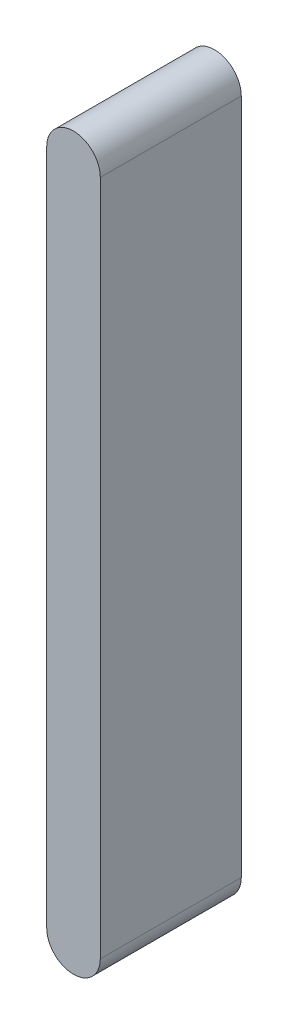
ISO-10303-21;
HEADER;
FILE_DESCRIPTION(('STEP AP214'),'2;1');
FILE_NAME('part.step','',(''),(''),'','','');
FILE_SCHEMA(('AUTOMOTIVE_DESIGN { 1 0 10303 214 1 1 1 1 }'));
ENDSEC;
DATA;
#1=APPLICATION_CONTEXT('core data for automotive mechanical design processes');
#2=APPLICATION_PROTOCOL_DEFINITION('international standard','automotive_design',2000,#1);
#3=PRODUCT_CONTEXT('',#1,'mechanical');
#4=PRODUCT('Part','Part','',(#3));
#5=PRODUCT_RELATED_PRODUCT_CATEGORY('part','',(#4));
#6=PRODUCT_DEFINITION_FORMATION('','',#4);
#7=PRODUCT_DEFINITION_CONTEXT('part definition',#1,'design');
#8=PRODUCT_DEFINITION('design','',#6,#7);
#9=PRODUCT_DEFINITION_SHAPE('','',#8);
#10=(LENGTH_UNIT() NAMED_UNIT(*) SI_UNIT(.MILLI.,.METRE.));
#11=(NAMED_UNIT(*) PLANE_ANGLE_UNIT() SI_UNIT($,.RADIAN.));
#12=(NAMED_UNIT(*) SI_UNIT($,.STERADIAN.) SOLID_ANGLE_UNIT());
#13=UNCERTAINTY_MEASURE_WITH_UNIT(LENGTH_MEASURE(1.E-05),#10,'distance_accuracy_value','');
#14=(GEOMETRIC_REPRESENTATION_CONTEXT(3) GLOBAL_UNCERTAINTY_ASSIGNED_CONTEXT((#13)) GLOBAL_UNIT_ASSIGNED_CONTEXT((#10,
#11,#12)) REPRESENTATION_CONTEXT('',''));
#15=CARTESIAN_POINT('',(0.,0.,0.));
#16=DIRECTION('',(0.,0.,1.));
#17=DIRECTION('',(1.,0.,0.));
#18=AXIS2_PLACEMENT_3D('',#15,#16,#17);
#19=CARTESIAN_POINT('',(0.,17.3590909090909,10.));
#20=DIRECTION('',(0.,0.,-1.));
#21=DIRECTION('',(-1.,0.,0.));
#22=AXIS2_PLACEMENT_3D('',#19,#20,#21);
#23=CYLINDRICAL_SURFACE('',#22,1.9);
#24=CARTESIAN_POINT('',(0.,17.3590909090909,0.));
#25=DIRECTION('',(0.,0.,1.));
#26=DIRECTION('',(1.,0.,0.));
#27=AXIS2_PLACEMENT_3D('',#24,#25,#26);
#28=CIRCLE('',#27,1.9);
#29=CARTESIAN_POINT('',(1.9,17.3590909090909,0.));
#30=VERTEX_POINT('',#29);
#31=CARTESIAN_POINT('',(-1.9,17.3590909090909,0.));
#32=VERTEX_POINT('',#31);
#33=EDGE_CURVE('E103',#30,#32,#28,.T.);
#34=ORIENTED_EDGE('',*,*,#33,.T.);
#35=DIRECTION('',(0.,0.,-1.));
#36=VECTOR('',#35,1.);
#37=CARTESIAN_POINT('',(-1.9,17.3590909090909,10.));
#38=LINE('',#37,#36);
#39=CARTESIAN_POINT('',(-1.9,17.3590909090909,10.));
#40=VERTEX_POINT('',#39);
#41=EDGE_CURVE('E11',#40,#32,#38,.T.);
#42=ORIENTED_EDGE('',*,*,#41,.F.);
#43=CARTESIAN_POINT('',(0.,17.3590909090909,10.));
#44=DIRECTION('',(0.,0.,1.));
#45=DIRECTION('',(1.,0.,0.));
#46=AXIS2_PLACEMENT_3D('',#43,#44,#45);
#47=CIRCLE('',#46,1.9);
#48=CARTESIAN_POINT('',(1.9,17.3590909090909,10.));
#49=VERTEX_POINT('',#48);
#50=EDGE_CURVE('E89',#49,#40,#47,.T.);
#51=ORIENTED_EDGE('',*,*,#50,.F.);
#52=DIRECTION('',(0.,0.,-1.));
#53=VECTOR('',#52,1.);
#54=CARTESIAN_POINT('',(1.9,17.3590909090909,10.));
#55=LINE('',#54,#53);
#56=EDGE_CURVE('E56',#49,#30,#55,.T.);
#57=ORIENTED_EDGE('',*,*,#56,.T.);
#58=EDGE_LOOP('',(#34,#42,#51,#57));
#59=FACE_BOUND('',#58,.T.);
#60=ADVANCED_FACE('F40',(#59),#23,.T.);
#61=CARTESIAN_POINT('',(-1.9,17.3590909090909,10.));
#62=DIRECTION('',(1.,0.,0.));
#63=DIRECTION('',(0.,1.,0.));
#64=AXIS2_PLACEMENT_3D('',#61,#62,#63);
#65=PLANE('',#64);
#66=DIRECTION('',(0.,-1.,0.));
#67=VECTOR('',#66,1.);
#68=CARTESIAN_POINT('',(-1.9,17.3590909090909,0.));
#69=LINE('',#68,#67);
#70=CARTESIAN_POINT('',(-1.89999999999999,-30.6409090909091,0.));
#71=VERTEX_POINT('',#70);
#72=EDGE_CURVE('E94',#32,#71,#69,.T.);
#73=ORIENTED_EDGE('',*,*,#72,.T.);
#74=DIRECTION('',(0.,0.,-1.));
#75=VECTOR('',#74,1.);
#76=CARTESIAN_POINT('',(-1.89999999999999,-30.6409090909091,10.));
#77=LINE('',#76,#75);
#78=CARTESIAN_POINT('',(-1.89999999999999,-30.6409090909091,10.));
#79=VERTEX_POINT('',#78);
#80=EDGE_CURVE('E48',#79,#71,#77,.T.);
#81=ORIENTED_EDGE('',*,*,#80,.F.);
#82=DIRECTION('',(0.,-1.,0.));
#83=VECTOR('',#82,1.);
#84=CARTESIAN_POINT('',(-1.9,17.3590909090909,10.));
#85=LINE('',#84,#83);
#86=EDGE_CURVE('E82',#40,#79,#85,.T.);
#87=ORIENTED_EDGE('',*,*,#86,.F.);
#88=ORIENTED_EDGE('',*,*,#41,.T.);
#89=EDGE_LOOP('',(#73,#81,#87,#88));
#90=FACE_BOUND('',#89,.T.);
#91=ADVANCED_FACE('F93',(#90),#65,.F.);
#92=CARTESIAN_POINT('',(0.,-30.6409090909091,10.));
#93=DIRECTION('',(0.,0.,-1.));
#94=DIRECTION('',(-1.,0.,0.));
#95=AXIS2_PLACEMENT_3D('',#92,#93,#94);
#96=CYLINDRICAL_SURFACE('',#95,1.9);
#97=CARTESIAN_POINT('',(0.,-30.6409090909091,0.));
#98=DIRECTION('',(0.,0.,1.));
#99=DIRECTION('',(1.,0.,0.));
#100=AXIS2_PLACEMENT_3D('',#97,#98,#99);
#101=CIRCLE('',#100,1.9);
#102=CARTESIAN_POINT('',(1.90000000000001,-30.6409090909091,0.));
#103=VERTEX_POINT('',#102);
#104=EDGE_CURVE('E106',#71,#103,#101,.T.);
#105=ORIENTED_EDGE('',*,*,#104,.T.);
#106=DIRECTION('',(0.,0.,-1.));
#107=VECTOR('',#106,1.);
#108=CARTESIAN_POINT('',(1.90000000000001,-30.6409090909091,10.));
#109=LINE('',#108,#107);
#110=CARTESIAN_POINT('',(1.90000000000001,-30.6409090909091,10.));
#111=VERTEX_POINT('',#110);
#112=EDGE_CURVE('E71',#111,#103,#109,.T.);
#113=ORIENTED_EDGE('',*,*,#112,.F.);
#114=CARTESIAN_POINT('',(0.,-30.6409090909091,10.));
#115=DIRECTION('',(0.,0.,1.));
#116=DIRECTION('',(1.,0.,0.));
#117=AXIS2_PLACEMENT_3D('',#114,#115,#116);
#118=CIRCLE('',#117,1.9);
#119=EDGE_CURVE('E88',#79,#111,#118,.T.);
#120=ORIENTED_EDGE('',*,*,#119,.F.);
#121=ORIENTED_EDGE('',*,*,#80,.T.);
#122=EDGE_LOOP('',(#105,#113,#120,#121));
#123=FACE_BOUND('',#122,.T.);
#124=ADVANCED_FACE('F97',(#123),#96,.T.);
#125=CARTESIAN_POINT('',(1.9,17.3590909090909,10.));
#126=DIRECTION('',(1.,0.,0.));
#127=DIRECTION('',(0.,1.,0.));
#128=AXIS2_PLACEMENT_3D('',#125,#126,#127);
#129=PLANE('',#128);
#130=DIRECTION('',(0.,-1.,0.));
#131=VECTOR('',#130,1.);
#132=CARTESIAN_POINT('',(1.9,17.3590909090909,0.));
#133=LINE('',#132,#131);
#134=EDGE_CURVE('E108',#30,#103,#133,.T.);
#135=ORIENTED_EDGE('',*,*,#134,.F.);
#136=ORIENTED_EDGE('',*,*,#56,.F.);
#137=DIRECTION('',(0.,-1.,0.));
#138=VECTOR('',#137,1.);
#139=CARTESIAN_POINT('',(1.9,17.3590909090909,10.));
#140=LINE('',#139,#138);
#141=EDGE_CURVE('E98',#49,#111,#140,.T.);
#142=ORIENTED_EDGE('',*,*,#141,.T.);
#143=ORIENTED_EDGE('',*,*,#112,.T.);
#144=EDGE_LOOP('',(#135,#136,#142,#143));
#145=FACE_BOUND('',#144,.T.);
#146=ADVANCED_FACE('F114',(#145),#129,.T.);
#147=CARTESIAN_POINT('',(0.,17.3590909090909,10.));
#148=DIRECTION('',(0.,0.,1.));
#149=DIRECTION('',(1.,0.,0.));
#150=AXIS2_PLACEMENT_3D('',#147,#148,#149);
#151=PLANE('',#150);
#152=ORIENTED_EDGE('',*,*,#50,.T.);
#153=ORIENTED_EDGE('',*,*,#86,.T.);
#154=ORIENTED_EDGE('',*,*,#119,.T.);
#155=ORIENTED_EDGE('',*,*,#141,.F.);
#156=EDGE_LOOP('',(#152,#153,#154,#155));
#157=FACE_BOUND('',#156,.T.);
#158=ADVANCED_FACE('F85',(#157),#151,.T.);
#159=CARTESIAN_POINT('',(0.,17.3590909090909,0.));
#160=DIRECTION('',(0.,0.,1.));
#161=DIRECTION('',(1.,0.,0.));
#162=AXIS2_PLACEMENT_3D('',#159,#160,#161);
#163=PLANE('',#162);
#164=ORIENTED_EDGE('',*,*,#33,.F.);
#165=ORIENTED_EDGE('',*,*,#134,.T.);
#166=ORIENTED_EDGE('',*,*,#104,.F.);
#167=ORIENTED_EDGE('',*,*,#72,.F.);
#168=EDGE_LOOP('',(#164,#165,#166,#167));
#169=FACE_BOUND('',#168,.T.);
#170=ADVANCED_FACE('F113',(#169),#163,.F.);
#171=CLOSED_SHELL('',(#60,#91,#124,#146,#158,#170));
#172=MANIFOLD_SOLID_BREP('B2',#171);
#173=ADVANCED_BREP_SHAPE_REPRESENTATION('',(#18,#172),#14);
#174=SHAPE_DEFINITION_REPRESENTATION(#9,#173);
ENDSEC;
END-ISO-10303-21;
